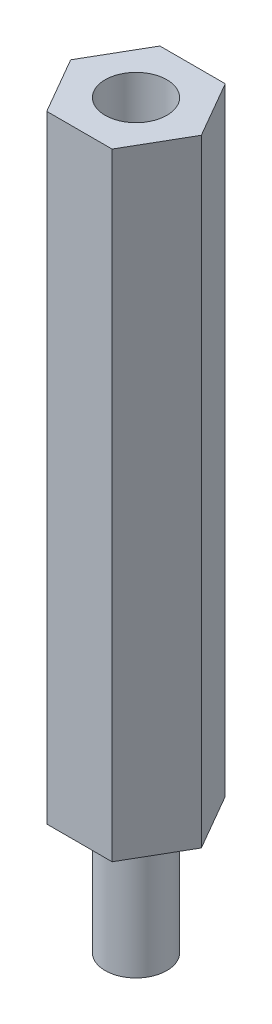
ISO-10303-21;
HEADER;
FILE_DESCRIPTION(('STEP AP214'),'2;1');
FILE_NAME('part.step','',(''),(''),'','','');
FILE_SCHEMA(('AUTOMOTIVE_DESIGN { 1 0 10303 214 1 1 1 1 }'));
ENDSEC;
DATA;
#1=APPLICATION_CONTEXT('core data for automotive mechanical design processes');
#2=APPLICATION_PROTOCOL_DEFINITION('international standard','automotive_design',2000,#1);
#3=PRODUCT_CONTEXT('',#1,'mechanical');
#4=PRODUCT('Part','Part','',(#3));
#5=PRODUCT_RELATED_PRODUCT_CATEGORY('part','',(#4));
#6=PRODUCT_DEFINITION_FORMATION('','',#4);
#7=PRODUCT_DEFINITION_CONTEXT('part definition',#1,'design');
#8=PRODUCT_DEFINITION('design','',#6,#7);
#9=PRODUCT_DEFINITION_SHAPE('','',#8);
#10=(LENGTH_UNIT() NAMED_UNIT(*) SI_UNIT(.MILLI.,.METRE.));
#11=(NAMED_UNIT(*) PLANE_ANGLE_UNIT() SI_UNIT($,.RADIAN.));
#12=(NAMED_UNIT(*) SI_UNIT($,.STERADIAN.) SOLID_ANGLE_UNIT());
#13=UNCERTAINTY_MEASURE_WITH_UNIT(LENGTH_MEASURE(1.E-05),#10,'distance_accuracy_value','');
#14=(GEOMETRIC_REPRESENTATION_CONTEXT(3) GLOBAL_UNCERTAINTY_ASSIGNED_CONTEXT((#13)) GLOBAL_UNIT_ASSIGNED_CONTEXT((#10,
#11,#12)) REPRESENTATION_CONTEXT('',''));
#15=CARTESIAN_POINT('',(0.,0.,0.));
#16=DIRECTION('',(0.,0.,1.));
#17=DIRECTION('',(1.,0.,0.));
#18=AXIS2_PLACEMENT_3D('',#15,#16,#17);
#19=CARTESIAN_POINT('',(-3.17542648054294,30.,0.));
#20=DIRECTION('',(0.866025403784446,0.,-0.499999999999988));
#21=DIRECTION('',(-0.499999999999988,0.,-0.866025403784446));
#22=AXIS2_PLACEMENT_3D('',#19,#20,#21);
#23=PLANE('',#22);
#24=DIRECTION('',(0.499999999999988,0.,0.866025403784445));
#25=VECTOR('',#24,1.);
#26=CARTESIAN_POINT('',(-3.17542648054294,0.,0.));
#27=LINE('',#26,#25);
#28=CARTESIAN_POINT('',(-3.17542648054294,0.,0.));
#29=VERTEX_POINT('',#28);
#30=CARTESIAN_POINT('',(-1.58771324027151,0.,2.74999999999998));
#31=VERTEX_POINT('',#30);
#32=EDGE_CURVE('E118',#29,#31,#27,.T.);
#33=ORIENTED_EDGE('',*,*,#32,.T.);
#34=DIRECTION('',(0.,-1.,0.));
#35=VECTOR('',#34,1.);
#36=CARTESIAN_POINT('',(-1.58771324027151,30.,2.74999999999998));
#37=LINE('',#36,#35);
#38=CARTESIAN_POINT('',(-1.58771324027151,30.,2.74999999999998));
#39=VERTEX_POINT('',#38);
#40=EDGE_CURVE('E35',#39,#31,#37,.T.);
#41=ORIENTED_EDGE('',*,*,#40,.F.);
#42=DIRECTION('',(0.499999999999988,0.,0.866025403784445));
#43=VECTOR('',#42,1.);
#44=CARTESIAN_POINT('',(-3.17542648054294,30.,0.));
#45=LINE('',#44,#43);
#46=CARTESIAN_POINT('',(-3.17542648054294,30.,0.));
#47=VERTEX_POINT('',#46);
#48=EDGE_CURVE('E129',#47,#39,#45,.T.);
#49=ORIENTED_EDGE('',*,*,#48,.F.);
#50=DIRECTION('',(0.,-1.,0.));
#51=VECTOR('',#50,1.);
#52=CARTESIAN_POINT('',(-3.17542648054294,30.,0.));
#53=LINE('',#52,#51);
#54=EDGE_CURVE('E114',#47,#29,#53,.T.);
#55=ORIENTED_EDGE('',*,*,#54,.T.);
#56=EDGE_LOOP('',(#33,#41,#49,#55));
#57=FACE_BOUND('',#56,.T.);
#58=ADVANCED_FACE('F32',(#57),#23,.F.);
#59=CARTESIAN_POINT('',(-1.58771324027151,30.,2.74999999999998));
#60=DIRECTION('',(0.,0.,-1.));
#61=DIRECTION('',(-1.,0.,0.));
#62=AXIS2_PLACEMENT_3D('',#59,#60,#61);
#63=PLANE('',#62);
#64=DIRECTION('',(1.,0.,0.));
#65=VECTOR('',#64,1.);
#66=CARTESIAN_POINT('',(-1.58771324027151,0.,2.74999999999998));
#67=LINE('',#66,#65);
#68=CARTESIAN_POINT('',(1.58771324027143,0.,2.75000000000002));
#69=VERTEX_POINT('',#68);
#70=EDGE_CURVE('E121',#31,#69,#67,.T.);
#71=ORIENTED_EDGE('',*,*,#70,.T.);
#72=DIRECTION('',(0.,-1.,0.));
#73=VECTOR('',#72,1.);
#74=CARTESIAN_POINT('',(1.58771324027143,30.,2.75000000000002));
#75=LINE('',#74,#73);
#76=CARTESIAN_POINT('',(1.58771324027143,30.,2.75000000000002));
#77=VERTEX_POINT('',#76);
#78=EDGE_CURVE('E132',#77,#69,#75,.T.);
#79=ORIENTED_EDGE('',*,*,#78,.F.);
#80=DIRECTION('',(1.,0.,0.));
#81=VECTOR('',#80,1.);
#82=CARTESIAN_POINT('',(-1.58771324027151,30.,2.74999999999998));
#83=LINE('',#82,#81);
#84=EDGE_CURVE('E87',#39,#77,#83,.T.);
#85=ORIENTED_EDGE('',*,*,#84,.F.);
#86=ORIENTED_EDGE('',*,*,#40,.T.);
#87=EDGE_LOOP('',(#71,#79,#85,#86));
#88=FACE_BOUND('',#87,.T.);
#89=ADVANCED_FACE('F137',(#88),#63,.F.);
#90=CARTESIAN_POINT('',(1.58771324027143,30.,2.75000000000002));
#91=DIRECTION('',(-0.866025403784432,0.,-0.500000000000011));
#92=DIRECTION('',(-0.500000000000011,0.,0.866025403784432));
#93=AXIS2_PLACEMENT_3D('',#90,#91,#92);
#94=PLANE('',#93);
#95=DIRECTION('',(0.500000000000011,0.,-0.866025403784432));
#96=VECTOR('',#95,1.);
#97=CARTESIAN_POINT('',(1.58771324027143,0.,2.75000000000002));
#98=LINE('',#97,#96);
#99=CARTESIAN_POINT('',(3.17542648054294,0.,0.));
#100=VERTEX_POINT('',#99);
#101=EDGE_CURVE('E124',#69,#100,#98,.T.);
#102=ORIENTED_EDGE('',*,*,#101,.T.);
#103=DIRECTION('',(0.,-1.,0.));
#104=VECTOR('',#103,1.);
#105=CARTESIAN_POINT('',(3.17542648054294,30.,0.));
#106=LINE('',#105,#104);
#107=CARTESIAN_POINT('',(3.17542648054294,30.,0.));
#108=VERTEX_POINT('',#107);
#109=EDGE_CURVE('E109',#108,#100,#106,.T.);
#110=ORIENTED_EDGE('',*,*,#109,.F.);
#111=DIRECTION('',(0.500000000000011,0.,-0.866025403784432));
#112=VECTOR('',#111,1.);
#113=CARTESIAN_POINT('',(1.58771324027143,30.,2.75000000000002));
#114=LINE('',#113,#112);
#115=EDGE_CURVE('E100',#77,#108,#114,.T.);
#116=ORIENTED_EDGE('',*,*,#115,.F.);
#117=ORIENTED_EDGE('',*,*,#78,.T.);
#118=EDGE_LOOP('',(#102,#110,#116,#117));
#119=FACE_BOUND('',#118,.T.);
#120=ADVANCED_FACE('F143',(#119),#94,.F.);
#121=CARTESIAN_POINT('',(3.17542648054294,30.,0.));
#122=DIRECTION('',(-0.866025403784445,0.,0.499999999999988));
#123=DIRECTION('',(0.499999999999988,0.,0.866025403784446));
#124=AXIS2_PLACEMENT_3D('',#121,#122,#123);
#125=PLANE('',#124);
#126=DIRECTION('',(-0.499999999999988,0.,-0.866025403784445));
#127=VECTOR('',#126,1.);
#128=CARTESIAN_POINT('',(3.17542648054294,0.,0.));
#129=LINE('',#128,#127);
#130=CARTESIAN_POINT('',(1.58771324027151,0.,-2.74999999999998));
#131=VERTEX_POINT('',#130);
#132=EDGE_CURVE('E108',#100,#131,#129,.T.);
#133=ORIENTED_EDGE('',*,*,#132,.T.);
#134=DIRECTION('',(0.,-1.,0.));
#135=VECTOR('',#134,1.);
#136=CARTESIAN_POINT('',(1.58771324027151,30.,-2.74999999999998));
#137=LINE('',#136,#135);
#138=CARTESIAN_POINT('',(1.58771324027151,30.,-2.74999999999998));
#139=VERTEX_POINT('',#138);
#140=EDGE_CURVE('E105',#139,#131,#137,.T.);
#141=ORIENTED_EDGE('',*,*,#140,.F.);
#142=DIRECTION('',(-0.499999999999988,0.,-0.866025403784445));
#143=VECTOR('',#142,1.);
#144=CARTESIAN_POINT('',(3.17542648054294,30.,0.));
#145=LINE('',#144,#143);
#146=EDGE_CURVE('E94',#108,#139,#145,.T.);
#147=ORIENTED_EDGE('',*,*,#146,.F.);
#148=ORIENTED_EDGE('',*,*,#109,.T.);
#149=EDGE_LOOP('',(#133,#141,#147,#148));
#150=FACE_BOUND('',#149,.T.);
#151=ADVANCED_FACE('F106',(#150),#125,.F.);
#152=CARTESIAN_POINT('',(1.58771324027151,30.,-2.74999999999998));
#153=DIRECTION('',(0.,0.,1.));
#154=DIRECTION('',(1.,0.,0.));
#155=AXIS2_PLACEMENT_3D('',#152,#153,#154);
#156=PLANE('',#155);
#157=DIRECTION('',(-1.,0.,0.));
#158=VECTOR('',#157,1.);
#159=CARTESIAN_POINT('',(1.58771324027151,0.,-2.74999999999998));
#160=LINE('',#159,#158);
#161=CARTESIAN_POINT('',(-1.58771324027143,0.,-2.75000000000002));
#162=VERTEX_POINT('',#161);
#163=EDGE_CURVE('E72',#131,#162,#160,.T.);
#164=ORIENTED_EDGE('',*,*,#163,.T.);
#165=DIRECTION('',(0.,-1.,0.));
#166=VECTOR('',#165,1.);
#167=CARTESIAN_POINT('',(-1.58771324027143,30.,-2.75000000000002));
#168=LINE('',#167,#166);
#169=CARTESIAN_POINT('',(-1.58771324027143,30.,-2.75000000000002));
#170=VERTEX_POINT('',#169);
#171=EDGE_CURVE('E110',#170,#162,#168,.T.);
#172=ORIENTED_EDGE('',*,*,#171,.F.);
#173=DIRECTION('',(-1.,0.,0.));
#174=VECTOR('',#173,1.);
#175=CARTESIAN_POINT('',(1.58771324027151,30.,-2.74999999999998));
#176=LINE('',#175,#174);
#177=EDGE_CURVE('E98',#139,#170,#176,.T.);
#178=ORIENTED_EDGE('',*,*,#177,.F.);
#179=ORIENTED_EDGE('',*,*,#140,.T.);
#180=EDGE_LOOP('',(#164,#172,#178,#179));
#181=FACE_BOUND('',#180,.T.);
#182=ADVANCED_FACE('F112',(#181),#156,.F.);
#183=CARTESIAN_POINT('',(-1.58771324027143,30.,-2.75000000000002));
#184=DIRECTION('',(0.866025403784432,0.,0.500000000000011));
#185=DIRECTION('',(0.500000000000011,0.,-0.866025403784432));
#186=AXIS2_PLACEMENT_3D('',#183,#184,#185);
#187=PLANE('',#186);
#188=DIRECTION('',(-0.500000000000011,0.,0.866025403784432));
#189=VECTOR('',#188,1.);
#190=CARTESIAN_POINT('',(-1.58771324027143,0.,-2.75000000000002));
#191=LINE('',#190,#189);
#192=EDGE_CURVE('E78',#162,#29,#191,.T.);
#193=ORIENTED_EDGE('',*,*,#192,.T.);
#194=ORIENTED_EDGE('',*,*,#54,.F.);
#195=DIRECTION('',(-0.500000000000011,0.,0.866025403784432));
#196=VECTOR('',#195,1.);
#197=CARTESIAN_POINT('',(-1.58771324027143,30.,-2.75000000000002));
#198=LINE('',#197,#196);
#199=EDGE_CURVE('E49',#170,#47,#198,.T.);
#200=ORIENTED_EDGE('',*,*,#199,.F.);
#201=ORIENTED_EDGE('',*,*,#171,.T.);
#202=EDGE_LOOP('',(#193,#194,#200,#201));
#203=FACE_BOUND('',#202,.T.);
#204=ADVANCED_FACE('F174',(#203),#187,.F.);
#205=CARTESIAN_POINT('',(0.,30.,0.));
#206=DIRECTION('',(0.,1.,0.));
#207=DIRECTION('',(0.,0.,1.));
#208=AXIS2_PLACEMENT_3D('',#205,#206,#207);
#209=PLANE('',#208);
#210=CARTESIAN_POINT('',(0.,30.,0.));
#211=DIRECTION('',(0.,1.,0.));
#212=DIRECTION('',(0.,0.,1.));
#213=AXIS2_PLACEMENT_3D('',#210,#211,#212);
#214=CIRCLE('',#213,1.5);
#215=CARTESIAN_POINT('',(0.,30.,1.5));
#216=VERTEX_POINT('',#215);
#217=EDGE_CURVE('E147',#216,#216,#214,.T.);
#218=ORIENTED_EDGE('',*,*,#217,.F.);
#219=EDGE_LOOP('',(#218));
#220=FACE_BOUND('',#219,.T.);
#221=ORIENTED_EDGE('',*,*,#48,.T.);
#222=ORIENTED_EDGE('',*,*,#84,.T.);
#223=ORIENTED_EDGE('',*,*,#115,.T.);
#224=ORIENTED_EDGE('',*,*,#146,.T.);
#225=ORIENTED_EDGE('',*,*,#177,.T.);
#226=ORIENTED_EDGE('',*,*,#199,.T.);
#227=EDGE_LOOP('',(#221,#222,#223,#224,#225,#226));
#228=FACE_BOUND('',#227,.T.);
#229=ADVANCED_FACE('F96',(#220,#228),#209,.T.);
#230=CARTESIAN_POINT('',(0.,0.,0.));
#231=DIRECTION('',(0.,1.,0.));
#232=DIRECTION('',(0.,0.,1.));
#233=AXIS2_PLACEMENT_3D('',#230,#231,#232);
#234=PLANE('',#233);
#235=CARTESIAN_POINT('',(0.,0.,0.));
#236=DIRECTION('',(0.,-1.,0.));
#237=DIRECTION('',(0.,0.,-1.));
#238=AXIS2_PLACEMENT_3D('',#235,#236,#237);
#239=CIRCLE('',#238,1.5);
#240=CARTESIAN_POINT('',(0.,0.,-1.5));
#241=VERTEX_POINT('',#240);
#242=EDGE_CURVE('E11',#241,#241,#239,.T.);
#243=ORIENTED_EDGE('',*,*,#242,.F.);
#244=EDGE_LOOP('',(#243));
#245=FACE_BOUND('',#244,.T.);
#246=ORIENTED_EDGE('',*,*,#32,.F.);
#247=ORIENTED_EDGE('',*,*,#192,.F.);
#248=ORIENTED_EDGE('',*,*,#163,.F.);
#249=ORIENTED_EDGE('',*,*,#132,.F.);
#250=ORIENTED_EDGE('',*,*,#101,.F.);
#251=ORIENTED_EDGE('',*,*,#70,.F.);
#252=EDGE_LOOP('',(#246,#247,#248,#249,#250,#251));
#253=FACE_BOUND('',#252,.T.);
#254=ADVANCED_FACE('F142',(#245,#253),#234,.F.);
#255=CARTESIAN_POINT('',(0.,15.,0.));
#256=DIRECTION('',(0.,1.,0.));
#257=DIRECTION('',(0.,0.,1.));
#258=AXIS2_PLACEMENT_3D('',#255,#256,#257);
#259=CYLINDRICAL_SURFACE('',#258,1.5);
#260=CARTESIAN_POINT('',(0.,15.,0.));
#261=DIRECTION('',(0.,1.,0.));
#262=DIRECTION('',(0.,0.,1.));
#263=AXIS2_PLACEMENT_3D('',#260,#261,#262);
#264=CIRCLE('',#263,1.5);
#265=CARTESIAN_POINT('',(0.,15.,1.5));
#266=VERTEX_POINT('',#265);
#267=EDGE_CURVE('E122',#266,#266,#264,.T.);
#268=ORIENTED_EDGE('',*,*,#267,.F.);
#269=EDGE_LOOP('',(#268));
#270=FACE_BOUND('',#269,.T.);
#271=ORIENTED_EDGE('',*,*,#217,.T.);
#272=EDGE_LOOP('',(#271));
#273=FACE_BOUND('',#272,.T.);
#274=ADVANCED_FACE('F166',(#270,#273),#259,.F.);
#275=CARTESIAN_POINT('',(0.,15.,0.));
#276=DIRECTION('',(0.,1.,0.));
#277=DIRECTION('',(0.,0.,1.));
#278=AXIS2_PLACEMENT_3D('',#275,#276,#277);
#279=PLANE('',#278);
#280=ORIENTED_EDGE('',*,*,#267,.T.);
#281=EDGE_LOOP('',(#280));
#282=FACE_BOUND('',#281,.T.);
#283=ADVANCED_FACE('F161',(#282),#279,.T.);
#284=CARTESIAN_POINT('',(0.,-6.,0.));
#285=DIRECTION('',(0.,1.,0.));
#286=DIRECTION('',(0.,0.,1.));
#287=AXIS2_PLACEMENT_3D('',#284,#285,#286);
#288=CYLINDRICAL_SURFACE('',#287,1.5);
#289=CARTESIAN_POINT('',(0.,-6.,0.));
#290=DIRECTION('',(0.,-1.,0.));
#291=DIRECTION('',(0.,0.,-1.));
#292=AXIS2_PLACEMENT_3D('',#289,#290,#291);
#293=CIRCLE('',#292,1.5);
#294=CARTESIAN_POINT('',(0.,-6.,-1.5));
#295=VERTEX_POINT('',#294);
#296=EDGE_CURVE('E150',#295,#295,#293,.T.);
#297=ORIENTED_EDGE('',*,*,#296,.F.);
#298=EDGE_LOOP('',(#297));
#299=FACE_BOUND('',#298,.T.);
#300=ORIENTED_EDGE('',*,*,#242,.T.);
#301=EDGE_LOOP('',(#300));
#302=FACE_BOUND('',#301,.T.);
#303=ADVANCED_FACE('F158',(#299,#302),#288,.T.);
#304=CARTESIAN_POINT('',(0.,-6.,0.));
#305=DIRECTION('',(0.,-1.,0.));
#306=DIRECTION('',(0.,0.,-1.));
#307=AXIS2_PLACEMENT_3D('',#304,#305,#306);
#308=PLANE('',#307);
#309=ORIENTED_EDGE('',*,*,#296,.T.);
#310=EDGE_LOOP('',(#309));
#311=FACE_BOUND('',#310,.T.);
#312=ADVANCED_FACE('F156',(#311),#308,.T.);
#313=CLOSED_SHELL('',(#58,#89,#120,#151,#182,#204,#229,#254,#274,#283,#303,#312));
#314=MANIFOLD_SOLID_BREP('B2',#313);
#315=ADVANCED_BREP_SHAPE_REPRESENTATION('',(#18,#314),#14);
#316=SHAPE_DEFINITION_REPRESENTATION(#9,#315);
ENDSEC;
END-ISO-10303-21;
